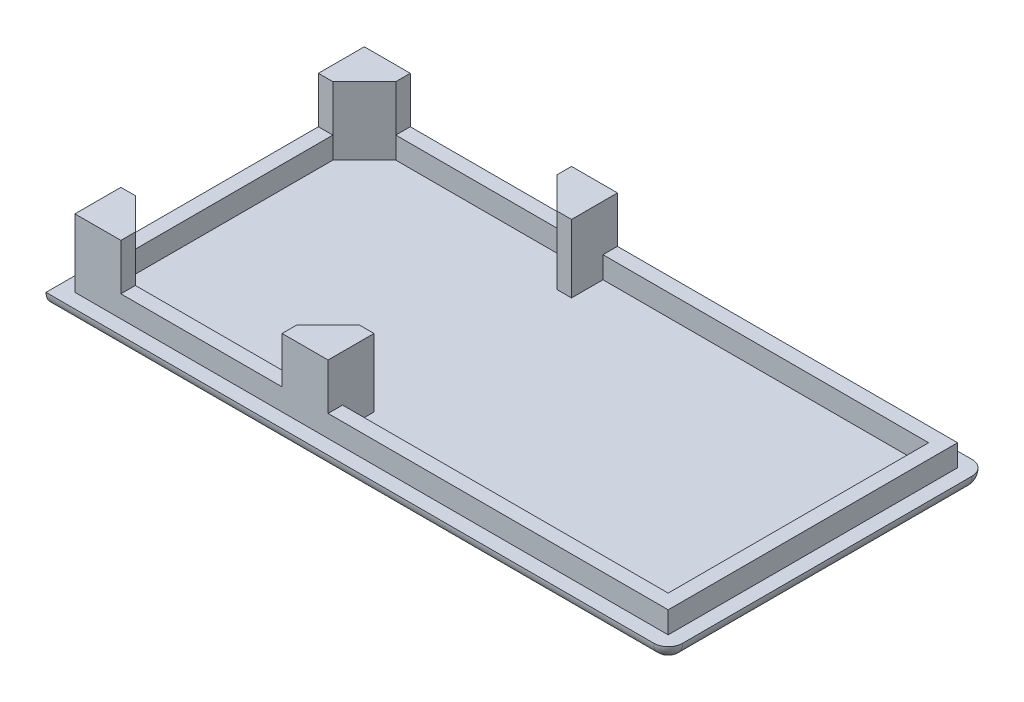
ISO-10303-21;
HEADER;
FILE_DESCRIPTION(('STEP AP214'),'2;1');
FILE_NAME('part.step','',(''),(''),'','','');
FILE_SCHEMA(('AUTOMOTIVE_DESIGN { 1 0 10303 214 1 1 1 1 }'));
ENDSEC;
DATA;
#1=APPLICATION_CONTEXT('core data for automotive mechanical design processes');
#2=APPLICATION_PROTOCOL_DEFINITION('international standard','automotive_design',2000,#1);
#3=PRODUCT_CONTEXT('',#1,'mechanical');
#4=PRODUCT('Part','Part','',(#3));
#5=PRODUCT_RELATED_PRODUCT_CATEGORY('part','',(#4));
#6=PRODUCT_DEFINITION_FORMATION('','',#4);
#7=PRODUCT_DEFINITION_CONTEXT('part definition',#1,'design');
#8=PRODUCT_DEFINITION('design','',#6,#7);
#9=PRODUCT_DEFINITION_SHAPE('','',#8);
#10=(LENGTH_UNIT() NAMED_UNIT(*) SI_UNIT(.MILLI.,.METRE.));
#11=(NAMED_UNIT(*) PLANE_ANGLE_UNIT() SI_UNIT($,.RADIAN.));
#12=(NAMED_UNIT(*) SI_UNIT($,.STERADIAN.) SOLID_ANGLE_UNIT());
#13=UNCERTAINTY_MEASURE_WITH_UNIT(LENGTH_MEASURE(1.E-05),#10,'distance_accuracy_value','');
#14=(GEOMETRIC_REPRESENTATION_CONTEXT(3) GLOBAL_UNCERTAINTY_ASSIGNED_CONTEXT((#13)) GLOBAL_UNIT_ASSIGNED_CONTEXT((#10,
#11,#12)) REPRESENTATION_CONTEXT('',''));
#15=CARTESIAN_POINT('',(0.,0.,0.));
#16=DIRECTION('',(0.,0.,1.));
#17=DIRECTION('',(1.,0.,0.));
#18=AXIS2_PLACEMENT_3D('',#15,#16,#17);
#19=CARTESIAN_POINT('',(0.,2.5,0.));
#20=DIRECTION('',(0.,1.,0.));
#21=DIRECTION('',(0.,0.,1.));
#22=AXIS2_PLACEMENT_3D('',#19,#20,#21);
#23=PLANE('',#22);
#24=DIRECTION('',(0.,0.,-1.));
#25=VECTOR('',#24,1.);
#26=CARTESIAN_POINT('',(18.494,2.5,0.));
#27=LINE('',#26,#25);
#28=CARTESIAN_POINT('',(18.494,2.5,2.));
#29=VERTEX_POINT('',#28);
#30=CARTESIAN_POINT('',(18.494,2.5,0.999999999999997));
#31=VERTEX_POINT('',#30);
#32=EDGE_CURVE('E304',#29,#31,#27,.T.);
#33=ORIENTED_EDGE('',*,*,#32,.F.);
#34=DIRECTION('',(-1.,0.,0.));
#35=VECTOR('',#34,1.);
#36=CARTESIAN_POINT('',(1.99999999999999,2.5,2.));
#37=LINE('',#36,#35);
#38=CARTESIAN_POINT('',(41.,2.5,2.));
#39=VERTEX_POINT('',#38);
#40=EDGE_CURVE('E416',#39,#29,#37,.T.);
#41=ORIENTED_EDGE('',*,*,#40,.F.);
#42=DIRECTION('',(0.,0.,-1.));
#43=VECTOR('',#42,1.);
#44=CARTESIAN_POINT('',(41.,2.5,2.));
#45=LINE('',#44,#43);
#46=CARTESIAN_POINT('',(41.,2.5,20.));
#47=VERTEX_POINT('',#46);
#48=EDGE_CURVE('E426',#47,#39,#45,.T.);
#49=ORIENTED_EDGE('',*,*,#48,.F.);
#50=DIRECTION('',(1.,0.,0.));
#51=VECTOR('',#50,1.);
#52=CARTESIAN_POINT('',(2.,2.5,20.));
#53=LINE('',#52,#51);
#54=CARTESIAN_POINT('',(18.494,2.5,20.));
#55=VERTEX_POINT('',#54);
#56=EDGE_CURVE('E422',#55,#47,#53,.T.);
#57=ORIENTED_EDGE('',*,*,#56,.F.);
#58=DIRECTION('',(0.,0.,-1.));
#59=VECTOR('',#58,1.);
#60=CARTESIAN_POINT('',(18.494,2.5,0.));
#61=LINE('',#60,#59);
#62=CARTESIAN_POINT('',(18.494,2.5,21.));
#63=VERTEX_POINT('',#62);
#64=EDGE_CURVE('E341',#63,#55,#61,.T.);
#65=ORIENTED_EDGE('',*,*,#64,.F.);
#66=DIRECTION('',(1.,0.,0.));
#67=VECTOR('',#66,1.);
#68=CARTESIAN_POINT('',(0.999999999999996,2.5,21.));
#69=LINE('',#68,#67);
#70=CARTESIAN_POINT('',(42.,2.5,21.));
#71=VERTEX_POINT('',#70);
#72=EDGE_CURVE('E448',#63,#71,#69,.T.);
#73=ORIENTED_EDGE('',*,*,#72,.T.);
#74=DIRECTION('',(0.,0.,-1.));
#75=VECTOR('',#74,1.);
#76=CARTESIAN_POINT('',(42.,2.5,0.999999999999997));
#77=LINE('',#76,#75);
#78=CARTESIAN_POINT('',(42.,2.5,0.999999999999997));
#79=VERTEX_POINT('',#78);
#80=EDGE_CURVE('E453',#71,#79,#77,.T.);
#81=ORIENTED_EDGE('',*,*,#80,.T.);
#82=DIRECTION('',(-1.,0.,0.));
#83=VECTOR('',#82,1.);
#84=CARTESIAN_POINT('',(0.999999999999994,2.5,0.999999999999997));
#85=LINE('',#84,#83);
#86=EDGE_CURVE('E455',#79,#31,#85,.T.);
#87=ORIENTED_EDGE('',*,*,#86,.T.);
#88=EDGE_LOOP('',(#33,#41,#49,#57,#65,#73,#81,#87));
#89=FACE_BOUND('',#88,.T.);
#90=ADVANCED_FACE('F35',(#89),#23,.T.);
#91=CARTESIAN_POINT('',(1.99999999999999,2.5,2.));
#92=DIRECTION('',(0.,0.,1.));
#93=DIRECTION('',(1.,0.,0.));
#94=AXIS2_PLACEMENT_3D('',#91,#92,#93);
#95=PLANE('',#94);
#96=DIRECTION('',(0.,1.,0.));
#97=VECTOR('',#96,1.);
#98=CARTESIAN_POINT('',(18.494,2.5,2.));
#99=LINE('',#98,#97);
#100=CARTESIAN_POINT('',(18.494,1.,2.));
#101=VERTEX_POINT('',#100);
#102=EDGE_CURVE('E297',#101,#29,#99,.T.);
#103=ORIENTED_EDGE('',*,*,#102,.F.);
#104=DIRECTION('',(-1.,0.,0.));
#105=VECTOR('',#104,1.);
#106=CARTESIAN_POINT('',(1.99999999999999,1.,2.));
#107=LINE('',#106,#105);
#108=CARTESIAN_POINT('',(41.,1.,2.));
#109=VERTEX_POINT('',#108);
#110=EDGE_CURVE('E429',#109,#101,#107,.T.);
#111=ORIENTED_EDGE('',*,*,#110,.F.);
#112=DIRECTION('',(0.,-1.,0.));
#113=VECTOR('',#112,1.);
#114=CARTESIAN_POINT('',(41.,2.5,2.));
#115=LINE('',#114,#113);
#116=EDGE_CURVE('E428',#39,#109,#115,.T.);
#117=ORIENTED_EDGE('',*,*,#116,.F.);
#118=ORIENTED_EDGE('',*,*,#40,.T.);
#119=EDGE_LOOP('',(#103,#111,#117,#118));
#120=FACE_BOUND('',#119,.T.);
#121=ADVANCED_FACE('F553',(#120),#95,.T.);
#122=DIRECTION('',(0.,0.,1.));
#123=VECTOR('',#122,1.);
#124=CARTESIAN_POINT('',(15.319,2.5,0.));
#125=LINE('',#124,#123);
#126=CARTESIAN_POINT('',(15.319,2.5,20.));
#127=VERTEX_POINT('',#126);
#128=CARTESIAN_POINT('',(15.319,2.5,21.));
#129=VERTEX_POINT('',#128);
#130=EDGE_CURVE('E343',#127,#129,#125,.T.);
#131=ORIENTED_EDGE('',*,*,#130,.F.);
#132=CARTESIAN_POINT('',(4.175,2.5,20.));
#133=VERTEX_POINT('',#132);
#134=EDGE_CURVE('E423',#133,#127,#53,.T.);
#135=ORIENTED_EDGE('',*,*,#134,.F.);
#136=DIRECTION('',(0.,0.,-1.));
#137=VECTOR('',#136,1.);
#138=CARTESIAN_POINT('',(4.175,2.5,0.));
#139=LINE('',#138,#137);
#140=CARTESIAN_POINT('',(4.175,2.5,21.));
#141=VERTEX_POINT('',#140);
#142=EDGE_CURVE('E401',#141,#133,#139,.T.);
#143=ORIENTED_EDGE('',*,*,#142,.F.);
#144=EDGE_CURVE('E450',#141,#129,#69,.T.);
#145=ORIENTED_EDGE('',*,*,#144,.T.);
#146=EDGE_LOOP('',(#131,#135,#143,#145));
#147=FACE_BOUND('',#146,.T.);
#148=ADVANCED_FACE('F556',(#147),#23,.T.);
#149=CARTESIAN_POINT('',(2.,2.5,20.));
#150=DIRECTION('',(0.,0.,-1.));
#151=DIRECTION('',(-1.,0.,0.));
#152=AXIS2_PLACEMENT_3D('',#149,#150,#151);
#153=PLANE('',#152);
#154=DIRECTION('',(0.,1.,0.));
#155=VECTOR('',#154,1.);
#156=CARTESIAN_POINT('',(15.319,1.,20.));
#157=LINE('',#156,#155);
#158=CARTESIAN_POINT('',(15.319,1.,20.));
#159=VERTEX_POINT('',#158);
#160=EDGE_CURVE('E331',#159,#127,#157,.T.);
#161=ORIENTED_EDGE('',*,*,#160,.F.);
#162=DIRECTION('',(1.,0.,0.));
#163=VECTOR('',#162,1.);
#164=CARTESIAN_POINT('',(2.,1.,20.));
#165=LINE('',#164,#163);
#166=CARTESIAN_POINT('',(4.175,1.,20.));
#167=VERTEX_POINT('',#166);
#168=EDGE_CURVE('E435',#167,#159,#165,.T.);
#169=ORIENTED_EDGE('',*,*,#168,.F.);
#170=DIRECTION('',(0.,1.,0.));
#171=VECTOR('',#170,1.);
#172=CARTESIAN_POINT('',(4.175,1.,20.));
#173=LINE('',#172,#171);
#174=EDGE_CURVE('E406',#167,#133,#173,.T.);
#175=ORIENTED_EDGE('',*,*,#174,.T.);
#176=ORIENTED_EDGE('',*,*,#134,.T.);
#177=EDGE_LOOP('',(#161,#169,#175,#176));
#178=FACE_BOUND('',#177,.T.);
#179=ADVANCED_FACE('F567',(#178),#153,.T.);
#180=DIRECTION('',(0.,0.,1.));
#181=VECTOR('',#180,1.);
#182=CARTESIAN_POINT('',(15.319,2.5,0.));
#183=LINE('',#182,#181);
#184=CARTESIAN_POINT('',(15.319,2.5,0.999999999999997));
#185=VERTEX_POINT('',#184);
#186=CARTESIAN_POINT('',(15.319,2.5,2.));
#187=VERTEX_POINT('',#186);
#188=EDGE_CURVE('E306',#185,#187,#183,.T.);
#189=ORIENTED_EDGE('',*,*,#188,.F.);
#190=CARTESIAN_POINT('',(4.17499999999999,2.5,0.999999999999997));
#191=VERTEX_POINT('',#190);
#192=EDGE_CURVE('E264',#185,#191,#85,.T.);
#193=ORIENTED_EDGE('',*,*,#192,.T.);
#194=DIRECTION('',(0.,0.,-1.));
#195=VECTOR('',#194,1.);
#196=CARTESIAN_POINT('',(4.175,2.5,0.));
#197=LINE('',#196,#195);
#198=CARTESIAN_POINT('',(4.17499999999999,2.5,2.));
#199=VERTEX_POINT('',#198);
#200=EDGE_CURVE('E377',#199,#191,#197,.T.);
#201=ORIENTED_EDGE('',*,*,#200,.F.);
#202=EDGE_CURVE('E420',#187,#199,#37,.T.);
#203=ORIENTED_EDGE('',*,*,#202,.F.);
#204=EDGE_LOOP('',(#189,#193,#201,#203));
#205=FACE_BOUND('',#204,.T.);
#206=ADVANCED_FACE('F569',(#205),#23,.T.);
#207=CARTESIAN_POINT('',(0.,1.,22.));
#208=DIRECTION('',(0.,-1.,0.));
#209=DIRECTION('',(0.,0.,-1.));
#210=AXIS2_PLACEMENT_3D('',#207,#208,#209);
#211=PLANE('',#210);
#212=DIRECTION('',(-1.,0.,0.));
#213=VECTOR('',#212,1.);
#214=CARTESIAN_POINT('',(0.,1.,22.));
#215=LINE('',#214,#213);
#216=CARTESIAN_POINT('',(42.,1.,22.));
#217=VERTEX_POINT('',#216);
#218=CARTESIAN_POINT('',(0.,1.,22.));
#219=VERTEX_POINT('',#218);
#220=EDGE_CURVE('E478',#217,#219,#215,.T.);
#221=ORIENTED_EDGE('',*,*,#220,.F.);
#222=CARTESIAN_POINT('',(42.,1.,21.));
#223=DIRECTION('',(0.,-1.,0.));
#224=DIRECTION('',(0.,0.,-1.));
#225=AXIS2_PLACEMENT_3D('',#222,#223,#224);
#226=CIRCLE('',#225,1.);
#227=CARTESIAN_POINT('',(43.,1.,21.));
#228=VERTEX_POINT('',#227);
#229=EDGE_CURVE('E494',#217,#228,#226,.F.);
#230=ORIENTED_EDGE('',*,*,#229,.T.);
#231=DIRECTION('',(0.,0.,-1.));
#232=VECTOR('',#231,1.);
#233=CARTESIAN_POINT('',(43.,1.,22.));
#234=LINE('',#233,#232);
#235=CARTESIAN_POINT('',(43.,1.,1.));
#236=VERTEX_POINT('',#235);
#237=EDGE_CURVE('E487',#228,#236,#234,.T.);
#238=ORIENTED_EDGE('',*,*,#237,.T.);
#239=CARTESIAN_POINT('',(42.,1.,1.));
#240=DIRECTION('',(0.,-1.,0.));
#241=DIRECTION('',(0.,0.,-1.));
#242=AXIS2_PLACEMENT_3D('',#239,#240,#241);
#243=CIRCLE('',#242,1.);
#244=CARTESIAN_POINT('',(42.,1.,0.));
#245=VERTEX_POINT('',#244);
#246=EDGE_CURVE('E492',#236,#245,#243,.F.);
#247=ORIENTED_EDGE('',*,*,#246,.T.);
#248=DIRECTION('',(-1.,0.,0.));
#249=VECTOR('',#248,1.);
#250=CARTESIAN_POINT('',(0.,1.,0.));
#251=LINE('',#250,#249);
#252=CARTESIAN_POINT('',(0.,1.,0.));
#253=VERTEX_POINT('',#252);
#254=EDGE_CURVE('E482',#245,#253,#251,.T.);
#255=ORIENTED_EDGE('',*,*,#254,.T.);
#256=DIRECTION('',(0.,0.,-1.));
#257=VECTOR('',#256,1.);
#258=CARTESIAN_POINT('',(0.,1.,22.));
#259=LINE('',#258,#257);
#260=EDGE_CURVE('E481',#219,#253,#259,.T.);
#261=ORIENTED_EDGE('',*,*,#260,.F.);
#262=EDGE_LOOP('',(#221,#230,#238,#247,#255,#261));
#263=FACE_BOUND('',#262,.T.);
#264=DIRECTION('',(0.,0.,1.));
#265=VECTOR('',#264,1.);
#266=CARTESIAN_POINT('',(0.999999999999994,1.,0.999999999999997));
#267=LINE('',#266,#265);
#268=CARTESIAN_POINT('',(0.999999999999994,1.,0.999999999999997));
#269=VERTEX_POINT('',#268);
#270=CARTESIAN_POINT('',(0.999999999999996,1.,21.));
#271=VERTEX_POINT('',#270);
#272=EDGE_CURVE('E445',#269,#271,#267,.T.);
#273=ORIENTED_EDGE('',*,*,#272,.F.);
#274=DIRECTION('',(-1.,0.,0.));
#275=VECTOR('',#274,1.);
#276=CARTESIAN_POINT('',(0.999999999999994,1.,0.999999999999997));
#277=LINE('',#276,#275);
#278=CARTESIAN_POINT('',(42.,1.,0.999999999999997));
#279=VERTEX_POINT('',#278);
#280=EDGE_CURVE('E449',#279,#269,#277,.T.);
#281=ORIENTED_EDGE('',*,*,#280,.F.);
#282=DIRECTION('',(0.,0.,-1.));
#283=VECTOR('',#282,1.);
#284=CARTESIAN_POINT('',(42.,1.,0.999999999999997));
#285=LINE('',#284,#283);
#286=CARTESIAN_POINT('',(42.,1.,21.));
#287=VERTEX_POINT('',#286);
#288=EDGE_CURVE('E462',#287,#279,#285,.T.);
#289=ORIENTED_EDGE('',*,*,#288,.F.);
#290=DIRECTION('',(1.,0.,0.));
#291=VECTOR('',#290,1.);
#292=CARTESIAN_POINT('',(0.999999999999996,1.,21.));
#293=LINE('',#292,#291);
#294=EDGE_CURVE('E460',#271,#287,#293,.T.);
#295=ORIENTED_EDGE('',*,*,#294,.F.);
#296=EDGE_LOOP('',(#273,#281,#289,#295));
#297=FACE_BOUND('',#296,.T.);
#298=ADVANCED_FACE('F525',(#263,#297),#211,.F.);
#299=CARTESIAN_POINT('',(0.,0.,22.));
#300=DIRECTION('',(1.,0.,0.));
#301=DIRECTION('',(0.,0.,-1.));
#302=AXIS2_PLACEMENT_3D('',#299,#300,#301);
#303=PLANE('',#302);
#304=ORIENTED_EDGE('',*,*,#260,.T.);
#305=CARTESIAN_POINT('',(0.,1.,1.));
#306=DIRECTION('',(1.,0.,0.));
#307=DIRECTION('',(0.,0.,-1.));
#308=AXIS2_PLACEMENT_3D('',#305,#306,#307);
#309=CIRCLE('',#308,1.);
#310=CARTESIAN_POINT('',(0.,0.,1.));
#311=VERTEX_POINT('',#310);
#312=EDGE_CURVE('E43',#253,#311,#309,.F.);
#313=ORIENTED_EDGE('',*,*,#312,.T.);
#314=DIRECTION('',(0.,0.,-1.));
#315=VECTOR('',#314,1.);
#316=CARTESIAN_POINT('',(0.,0.,22.));
#317=LINE('',#316,#315);
#318=CARTESIAN_POINT('',(0.,0.,21.));
#319=VERTEX_POINT('',#318);
#320=EDGE_CURVE('E489',#319,#311,#317,.T.);
#321=ORIENTED_EDGE('',*,*,#320,.F.);
#322=CARTESIAN_POINT('',(0.,1.,21.));
#323=DIRECTION('',(1.,0.,0.));
#324=DIRECTION('',(0.,0.,-1.));
#325=AXIS2_PLACEMENT_3D('',#322,#323,#324);
#326=CIRCLE('',#325,1.);
#327=EDGE_CURVE('E503',#319,#219,#326,.F.);
#328=ORIENTED_EDGE('',*,*,#327,.T.);
#329=EDGE_LOOP('',(#304,#313,#321,#328));
#330=FACE_BOUND('',#329,.T.);
#331=ADVANCED_FACE('F528',(#330),#303,.F.);
#332=CARTESIAN_POINT('',(0.,0.,22.));
#333=DIRECTION('',(0.,1.,0.));
#334=DIRECTION('',(0.,0.,1.));
#335=AXIS2_PLACEMENT_3D('',#332,#333,#334);
#336=PLANE('',#335);
#337=ORIENTED_EDGE('',*,*,#320,.T.);
#338=DIRECTION('',(1.,0.,0.));
#339=VECTOR('',#338,1.);
#340=CARTESIAN_POINT('',(43.,0.,1.));
#341=LINE('',#340,#339);
#342=CARTESIAN_POINT('',(42.,0.,1.));
#343=VERTEX_POINT('',#342);
#344=EDGE_CURVE('E501',#311,#343,#341,.T.);
#345=ORIENTED_EDGE('',*,*,#344,.T.);
#346=DIRECTION('',(0.,0.,-1.));
#347=VECTOR('',#346,1.);
#348=CARTESIAN_POINT('',(42.,0.,22.));
#349=LINE('',#348,#347);
#350=CARTESIAN_POINT('',(42.,0.,21.));
#351=VERTEX_POINT('',#350);
#352=EDGE_CURVE('E499',#343,#351,#349,.F.);
#353=ORIENTED_EDGE('',*,*,#352,.T.);
#354=DIRECTION('',(1.,0.,0.));
#355=VECTOR('',#354,1.);
#356=CARTESIAN_POINT('',(0.,0.,21.));
#357=LINE('',#356,#355);
#358=EDGE_CURVE('E497',#351,#319,#357,.F.);
#359=ORIENTED_EDGE('',*,*,#358,.T.);
#360=EDGE_LOOP('',(#337,#345,#353,#359));
#361=FACE_BOUND('',#360,.T.);
#362=ADVANCED_FACE('F543',(#361),#336,.F.);
#363=CARTESIAN_POINT('',(0.,1.,1.));
#364=DIRECTION('',(-1.,0.,0.));
#365=DIRECTION('',(0.,0.,1.));
#366=AXIS2_PLACEMENT_3D('',#363,#364,#365);
#367=CYLINDRICAL_SURFACE('',#366,1.);
#368=ORIENTED_EDGE('',*,*,#312,.F.);
#369=ORIENTED_EDGE('',*,*,#254,.F.);
#370=CARTESIAN_POINT('',(42.,1.,1.));
#371=DIRECTION('',(1.,0.,0.));
#372=DIRECTION('',(0.,0.,-1.));
#373=AXIS2_PLACEMENT_3D('',#370,#371,#372);
#374=CIRCLE('',#373,1.);
#375=EDGE_CURVE('E484',#343,#245,#374,.T.);
#376=ORIENTED_EDGE('',*,*,#375,.F.);
#377=ORIENTED_EDGE('',*,*,#344,.F.);
#378=EDGE_LOOP('',(#368,#369,#376,#377));
#379=FACE_BOUND('',#378,.T.);
#380=ADVANCED_FACE('F37',(#379),#367,.T.);
#381=CARTESIAN_POINT('',(42.,1.,1.));
#382=DIRECTION('',(0.,0.,1.));
#383=DIRECTION('',(1.,0.,0.));
#384=AXIS2_PLACEMENT_3D('',#381,#382,#383);
#385=SPHERICAL_SURFACE('',#384,1.);
#386=ORIENTED_EDGE('',*,*,#375,.T.);
#387=ORIENTED_EDGE('',*,*,#246,.F.);
#388=CARTESIAN_POINT('',(42.,1.,1.));
#389=DIRECTION('',(0.,0.,-1.));
#390=DIRECTION('',(-1.,0.,0.));
#391=AXIS2_PLACEMENT_3D('',#388,#389,#390);
#392=CIRCLE('',#391,1.);
#393=EDGE_CURVE('E510',#343,#236,#392,.F.);
#394=ORIENTED_EDGE('',*,*,#393,.F.);
#395=EDGE_LOOP('',(#386,#387,#394));
#396=FACE_BOUND('',#395,.T.);
#397=ADVANCED_FACE('F517',(#396),#385,.T.);
#398=CARTESIAN_POINT('',(42.,1.,22.));
#399=DIRECTION('',(0.,0.,-1.));
#400=DIRECTION('',(-1.,0.,0.));
#401=AXIS2_PLACEMENT_3D('',#398,#399,#400);
#402=CYLINDRICAL_SURFACE('',#401,1.);
#403=ORIENTED_EDGE('',*,*,#393,.T.);
#404=ORIENTED_EDGE('',*,*,#237,.F.);
#405=CARTESIAN_POINT('',(42.,1.,21.));
#406=DIRECTION('',(0.,0.,1.));
#407=DIRECTION('',(1.,0.,0.));
#408=AXIS2_PLACEMENT_3D('',#405,#406,#407);
#409=CIRCLE('',#408,1.);
#410=EDGE_CURVE('E508',#351,#228,#409,.T.);
#411=ORIENTED_EDGE('',*,*,#410,.F.);
#412=ORIENTED_EDGE('',*,*,#352,.F.);
#413=EDGE_LOOP('',(#403,#404,#411,#412));
#414=FACE_BOUND('',#413,.T.);
#415=ADVANCED_FACE('F541',(#414),#402,.T.);
#416=CARTESIAN_POINT('',(0.,1.,21.));
#417=DIRECTION('',(1.,0.,0.));
#418=DIRECTION('',(0.,0.,-1.));
#419=AXIS2_PLACEMENT_3D('',#416,#417,#418);
#420=CYLINDRICAL_SURFACE('',#419,1.);
#421=ORIENTED_EDGE('',*,*,#327,.F.);
#422=ORIENTED_EDGE('',*,*,#358,.F.);
#423=CARTESIAN_POINT('',(42.,1.,21.));
#424=DIRECTION('',(1.,0.,0.));
#425=DIRECTION('',(0.,0.,-1.));
#426=AXIS2_PLACEMENT_3D('',#423,#424,#425);
#427=CIRCLE('',#426,1.);
#428=EDGE_CURVE('E477',#217,#351,#427,.T.);
#429=ORIENTED_EDGE('',*,*,#428,.F.);
#430=ORIENTED_EDGE('',*,*,#220,.T.);
#431=EDGE_LOOP('',(#421,#422,#429,#430));
#432=FACE_BOUND('',#431,.T.);
#433=ADVANCED_FACE('F533',(#432),#420,.T.);
#434=CARTESIAN_POINT('',(42.,1.,21.));
#435=DIRECTION('',(0.,0.,1.));
#436=DIRECTION('',(1.,0.,0.));
#437=AXIS2_PLACEMENT_3D('',#434,#435,#436);
#438=SPHERICAL_SURFACE('',#437,1.);
#439=ORIENTED_EDGE('',*,*,#229,.F.);
#440=ORIENTED_EDGE('',*,*,#428,.T.);
#441=ORIENTED_EDGE('',*,*,#410,.T.);
#442=EDGE_LOOP('',(#439,#440,#441));
#443=FACE_BOUND('',#442,.T.);
#444=ADVANCED_FACE('F539',(#443),#438,.T.);
#445=DIRECTION('',(1.,0.,0.));
#446=VECTOR('',#445,1.);
#447=CARTESIAN_POINT('',(0.,2.5,4.175));
#448=LINE('',#447,#446);
#449=CARTESIAN_POINT('',(0.999999999999994,2.5,4.175));
#450=VERTEX_POINT('',#449);
#451=CARTESIAN_POINT('',(1.99999999999999,2.5,4.175));
#452=VERTEX_POINT('',#451);
#453=EDGE_CURVE('E366',#450,#452,#448,.T.);
#454=ORIENTED_EDGE('',*,*,#453,.F.);
#455=DIRECTION('',(0.,0.,1.));
#456=VECTOR('',#455,1.);
#457=CARTESIAN_POINT('',(0.999999999999994,2.5,0.999999999999997));
#458=LINE('',#457,#456);
#459=CARTESIAN_POINT('',(0.999999999999994,2.5,17.825));
#460=VERTEX_POINT('',#459);
#461=EDGE_CURVE('E446',#450,#460,#458,.T.);
#462=ORIENTED_EDGE('',*,*,#461,.T.);
#463=DIRECTION('',(-1.,0.,0.));
#464=VECTOR('',#463,1.);
#465=CARTESIAN_POINT('',(0.,2.5,17.825));
#466=LINE('',#465,#464);
#467=CARTESIAN_POINT('',(1.99999999999999,2.5,17.825));
#468=VERTEX_POINT('',#467);
#469=EDGE_CURVE('E412',#468,#460,#466,.T.);
#470=ORIENTED_EDGE('',*,*,#469,.F.);
#471=DIRECTION('',(0.,0.,1.));
#472=VECTOR('',#471,1.);
#473=CARTESIAN_POINT('',(1.99999999999999,2.5,2.));
#474=LINE('',#473,#472);
#475=EDGE_CURVE('E419',#452,#468,#474,.T.);
#476=ORIENTED_EDGE('',*,*,#475,.F.);
#477=EDGE_LOOP('',(#454,#462,#470,#476));
#478=FACE_BOUND('',#477,.T.);
#479=ADVANCED_FACE('F557',(#478),#23,.T.);
#480=CARTESIAN_POINT('',(0.999999999999994,2.5,0.999999999999997));
#481=DIRECTION('',(1.,0.,0.));
#482=DIRECTION('',(0.,0.,-1.));
#483=AXIS2_PLACEMENT_3D('',#480,#481,#482);
#484=PLANE('',#483);
#485=ORIENTED_EDGE('',*,*,#461,.F.);
#486=DIRECTION('',(0.,1.,0.));
#487=VECTOR('',#486,1.);
#488=CARTESIAN_POINT('',(0.999999999999994,1.,4.175));
#489=LINE('',#488,#487);
#490=CARTESIAN_POINT('',(0.999999999999994,5.699,4.175));
#491=VERTEX_POINT('',#490);
#492=EDGE_CURVE('E363',#450,#491,#489,.T.);
#493=ORIENTED_EDGE('',*,*,#492,.T.);
#494=DIRECTION('',(0.,0.,1.));
#495=VECTOR('',#494,1.);
#496=CARTESIAN_POINT('',(0.999999999999994,5.699,0.999999999999997));
#497=LINE('',#496,#495);
#498=CARTESIAN_POINT('',(0.999999999999994,5.699,0.999999999999997));
#499=VERTEX_POINT('',#498);
#500=EDGE_CURVE('E348',#499,#491,#497,.T.);
#501=ORIENTED_EDGE('',*,*,#500,.F.);
#502=DIRECTION('',(0.,-1.,0.));
#503=VECTOR('',#502,1.);
#504=CARTESIAN_POINT('',(0.999999999999994,2.5,0.999999999999997));
#505=LINE('',#504,#503);
#506=EDGE_CURVE('E458',#499,#269,#505,.T.);
#507=ORIENTED_EDGE('',*,*,#506,.T.);
#508=ORIENTED_EDGE('',*,*,#272,.T.);
#509=DIRECTION('',(0.,-1.,0.));
#510=VECTOR('',#509,1.);
#511=CARTESIAN_POINT('',(0.999999999999996,2.5,21.));
#512=LINE('',#511,#510);
#513=CARTESIAN_POINT('',(0.999999999999996,5.699,21.));
#514=VERTEX_POINT('',#513);
#515=EDGE_CURVE('E474',#514,#271,#512,.T.);
#516=ORIENTED_EDGE('',*,*,#515,.F.);
#517=DIRECTION('',(0.,0.,1.));
#518=VECTOR('',#517,1.);
#519=CARTESIAN_POINT('',(0.999999999999994,5.699,17.825));
#520=LINE('',#519,#518);
#521=CARTESIAN_POINT('',(0.999999999999994,5.699,17.825));
#522=VERTEX_POINT('',#521);
#523=EDGE_CURVE('E380',#522,#514,#520,.T.);
#524=ORIENTED_EDGE('',*,*,#523,.F.);
#525=DIRECTION('',(0.,1.,0.));
#526=VECTOR('',#525,1.);
#527=CARTESIAN_POINT('',(0.999999999999994,1.,17.825));
#528=LINE('',#527,#526);
#529=EDGE_CURVE('E399',#460,#522,#528,.T.);
#530=ORIENTED_EDGE('',*,*,#529,.F.);
#531=EDGE_LOOP('',(#485,#493,#501,#507,#508,#516,#524,#530));
#532=FACE_BOUND('',#531,.T.);
#533=ADVANCED_FACE('F571',(#532),#484,.F.);
#534=CARTESIAN_POINT('',(0.999999999999996,2.5,21.));
#535=DIRECTION('',(0.,0.,-1.));
#536=DIRECTION('',(-1.,0.,0.));
#537=AXIS2_PLACEMENT_3D('',#534,#535,#536);
#538=PLANE('',#537);
#539=ORIENTED_EDGE('',*,*,#72,.F.);
#540=DIRECTION('',(0.,1.,0.));
#541=VECTOR('',#540,1.);
#542=CARTESIAN_POINT('',(18.494,1.,21.));
#543=LINE('',#542,#541);
#544=CARTESIAN_POINT('',(18.494,5.699,21.));
#545=VERTEX_POINT('',#544);
#546=EDGE_CURVE('E328',#63,#545,#543,.T.);
#547=ORIENTED_EDGE('',*,*,#546,.T.);
#548=DIRECTION('',(1.,0.,0.));
#549=VECTOR('',#548,1.);
#550=CARTESIAN_POINT('',(15.319,5.699,21.));
#551=LINE('',#550,#549);
#552=CARTESIAN_POINT('',(15.319,5.699,21.));
#553=VERTEX_POINT('',#552);
#554=EDGE_CURVE('E308',#553,#545,#551,.T.);
#555=ORIENTED_EDGE('',*,*,#554,.F.);
#556=DIRECTION('',(0.,1.,0.));
#557=VECTOR('',#556,1.);
#558=CARTESIAN_POINT('',(15.319,1.,21.));
#559=LINE('',#558,#557);
#560=EDGE_CURVE('E329',#129,#553,#559,.T.);
#561=ORIENTED_EDGE('',*,*,#560,.F.);
#562=ORIENTED_EDGE('',*,*,#144,.F.);
#563=DIRECTION('',(0.,1.,0.));
#564=VECTOR('',#563,1.);
#565=CARTESIAN_POINT('',(4.175,1.,21.));
#566=LINE('',#565,#564);
#567=CARTESIAN_POINT('',(4.175,5.699,21.));
#568=VERTEX_POINT('',#567);
#569=EDGE_CURVE('E398',#141,#568,#566,.T.);
#570=ORIENTED_EDGE('',*,*,#569,.T.);
#571=DIRECTION('',(1.,0.,0.));
#572=VECTOR('',#571,1.);
#573=CARTESIAN_POINT('',(0.999999999999996,5.699,21.));
#574=LINE('',#573,#572);
#575=EDGE_CURVE('E383',#514,#568,#574,.T.);
#576=ORIENTED_EDGE('',*,*,#575,.F.);
#577=ORIENTED_EDGE('',*,*,#515,.T.);
#578=ORIENTED_EDGE('',*,*,#294,.T.);
#579=DIRECTION('',(0.,-1.,0.));
#580=VECTOR('',#579,1.);
#581=CARTESIAN_POINT('',(42.,2.5,21.));
#582=LINE('',#581,#580);
#583=EDGE_CURVE('E471',#71,#287,#582,.T.);
#584=ORIENTED_EDGE('',*,*,#583,.F.);
#585=EDGE_LOOP('',(#539,#547,#555,#561,#562,#570,#576,#577,#578,#584));
#586=FACE_BOUND('',#585,.T.);
#587=ADVANCED_FACE('F577',(#586),#538,.F.);
#588=CARTESIAN_POINT('',(42.,2.5,0.999999999999997));
#589=DIRECTION('',(-1.,0.,0.));
#590=DIRECTION('',(0.,0.,1.));
#591=AXIS2_PLACEMENT_3D('',#588,#589,#590);
#592=PLANE('',#591);
#593=ORIENTED_EDGE('',*,*,#288,.T.);
#594=DIRECTION('',(0.,-1.,0.));
#595=VECTOR('',#594,1.);
#596=CARTESIAN_POINT('',(42.,2.5,0.999999999999997));
#597=LINE('',#596,#595);
#598=EDGE_CURVE('E468',#79,#279,#597,.T.);
#599=ORIENTED_EDGE('',*,*,#598,.F.);
#600=ORIENTED_EDGE('',*,*,#80,.F.);
#601=ORIENTED_EDGE('',*,*,#583,.T.);
#602=EDGE_LOOP('',(#593,#599,#600,#601));
#603=FACE_BOUND('',#602,.T.);
#604=ADVANCED_FACE('F729',(#603),#592,.F.);
#605=CARTESIAN_POINT('',(0.999999999999994,2.5,0.999999999999997));
#606=DIRECTION('',(0.,0.,1.));
#607=DIRECTION('',(1.,0.,0.));
#608=AXIS2_PLACEMENT_3D('',#605,#606,#607);
#609=PLANE('',#608);
#610=ORIENTED_EDGE('',*,*,#192,.F.);
#611=DIRECTION('',(0.,1.,0.));
#612=VECTOR('',#611,1.);
#613=CARTESIAN_POINT('',(15.319,1.,0.999999999999997));
#614=LINE('',#613,#612);
#615=CARTESIAN_POINT('',(15.319,5.699,0.999999999999997));
#616=VERTEX_POINT('',#615);
#617=EDGE_CURVE('E257',#185,#616,#614,.T.);
#618=ORIENTED_EDGE('',*,*,#617,.T.);
#619=DIRECTION('',(-1.,0.,0.));
#620=VECTOR('',#619,1.);
#621=CARTESIAN_POINT('',(15.319,5.699,0.999999999999997));
#622=LINE('',#621,#620);
#623=CARTESIAN_POINT('',(18.494,5.699,0.999999999999997));
#624=VERTEX_POINT('',#623);
#625=EDGE_CURVE('E262',#624,#616,#622,.T.);
#626=ORIENTED_EDGE('',*,*,#625,.F.);
#627=DIRECTION('',(0.,1.,0.));
#628=VECTOR('',#627,1.);
#629=CARTESIAN_POINT('',(18.494,1.,0.999999999999997));
#630=LINE('',#629,#628);
#631=EDGE_CURVE('E295',#31,#624,#630,.T.);
#632=ORIENTED_EDGE('',*,*,#631,.F.);
#633=ORIENTED_EDGE('',*,*,#86,.F.);
#634=ORIENTED_EDGE('',*,*,#598,.T.);
#635=ORIENTED_EDGE('',*,*,#280,.T.);
#636=ORIENTED_EDGE('',*,*,#506,.F.);
#637=DIRECTION('',(-1.,0.,0.));
#638=VECTOR('',#637,1.);
#639=CARTESIAN_POINT('',(4.17499999999999,5.699,0.999999999999997));
#640=LINE('',#639,#638);
#641=CARTESIAN_POINT('',(4.17499999999999,5.699,0.999999999999997));
#642=VERTEX_POINT('',#641);
#643=EDGE_CURVE('E345',#642,#499,#640,.T.);
#644=ORIENTED_EDGE('',*,*,#643,.F.);
#645=DIRECTION('',(0.,1.,0.));
#646=VECTOR('',#645,1.);
#647=CARTESIAN_POINT('',(4.17499999999999,1.,0.999999999999997));
#648=LINE('',#647,#646);
#649=EDGE_CURVE('E364',#191,#642,#648,.T.);
#650=ORIENTED_EDGE('',*,*,#649,.F.);
#651=EDGE_LOOP('',(#610,#618,#626,#632,#633,#634,#635,#636,#644,#650));
#652=FACE_BOUND('',#651,.T.);
#653=ADVANCED_FACE('F259',(#652),#609,.F.);
#654=DIRECTION('',(0.,1.,0.));
#655=VECTOR('',#654,1.);
#656=CARTESIAN_POINT('',(15.319,1.,2.));
#657=LINE('',#656,#655);
#658=CARTESIAN_POINT('',(15.319,1.,1.99999999999999));
#659=VERTEX_POINT('',#658);
#660=EDGE_CURVE('E50',#659,#187,#657,.T.);
#661=ORIENTED_EDGE('',*,*,#660,.T.);
#662=ORIENTED_EDGE('',*,*,#202,.T.);
#663=DIRECTION('',(0.,1.,0.));
#664=VECTOR('',#663,1.);
#665=CARTESIAN_POINT('',(4.17499999999999,1.,2.));
#666=LINE('',#665,#664);
#667=CARTESIAN_POINT('',(4.17499999999999,1.,2.));
#668=VERTEX_POINT('',#667);
#669=EDGE_CURVE('E367',#668,#199,#666,.T.);
#670=ORIENTED_EDGE('',*,*,#669,.F.);
#671=EDGE_CURVE('E415',#659,#668,#107,.T.);
#672=ORIENTED_EDGE('',*,*,#671,.F.);
#673=EDGE_LOOP('',(#661,#662,#670,#672));
#674=FACE_BOUND('',#673,.T.);
#675=ADVANCED_FACE('F563',(#674),#95,.T.);
#676=CARTESIAN_POINT('',(1.99999999999999,2.5,2.));
#677=DIRECTION('',(1.,0.,0.));
#678=DIRECTION('',(0.,0.,-1.));
#679=AXIS2_PLACEMENT_3D('',#676,#677,#678);
#680=PLANE('',#679);
#681=DIRECTION('',(0.,1.,0.));
#682=VECTOR('',#681,1.);
#683=CARTESIAN_POINT('',(1.99999999999999,1.,4.175));
#684=LINE('',#683,#682);
#685=CARTESIAN_POINT('',(2.,1.,4.175));
#686=VERTEX_POINT('',#685);
#687=EDGE_CURVE('E371',#686,#452,#684,.T.);
#688=ORIENTED_EDGE('',*,*,#687,.T.);
#689=ORIENTED_EDGE('',*,*,#475,.T.);
#690=DIRECTION('',(0.,1.,0.));
#691=VECTOR('',#690,1.);
#692=CARTESIAN_POINT('',(1.99999999999999,1.,17.825));
#693=LINE('',#692,#691);
#694=CARTESIAN_POINT('',(1.99999999999999,1.,17.825));
#695=VERTEX_POINT('',#694);
#696=EDGE_CURVE('E402',#695,#468,#693,.T.);
#697=ORIENTED_EDGE('',*,*,#696,.F.);
#698=DIRECTION('',(0.,0.,1.));
#699=VECTOR('',#698,1.);
#700=CARTESIAN_POINT('',(1.99999999999999,1.,2.));
#701=LINE('',#700,#699);
#702=EDGE_CURVE('E432',#686,#695,#701,.T.);
#703=ORIENTED_EDGE('',*,*,#702,.F.);
#704=EDGE_LOOP('',(#688,#689,#697,#703));
#705=FACE_BOUND('',#704,.T.);
#706=ADVANCED_FACE('F609',(#705),#680,.T.);
#707=DIRECTION('',(0.,-1.,0.));
#708=VECTOR('',#707,1.);
#709=CARTESIAN_POINT('',(18.494,2.5,20.));
#710=LINE('',#709,#708);
#711=CARTESIAN_POINT('',(18.494,1.,20.));
#712=VERTEX_POINT('',#711);
#713=EDGE_CURVE('E58',#55,#712,#710,.T.);
#714=ORIENTED_EDGE('',*,*,#713,.F.);
#715=ORIENTED_EDGE('',*,*,#56,.T.);
#716=DIRECTION('',(0.,-1.,0.));
#717=VECTOR('',#716,1.);
#718=CARTESIAN_POINT('',(41.,2.5,20.));
#719=LINE('',#718,#717);
#720=CARTESIAN_POINT('',(41.,1.,20.));
#721=VERTEX_POINT('',#720);
#722=EDGE_CURVE('E442',#47,#721,#719,.T.);
#723=ORIENTED_EDGE('',*,*,#722,.T.);
#724=EDGE_CURVE('E434',#712,#721,#165,.T.);
#725=ORIENTED_EDGE('',*,*,#724,.F.);
#726=EDGE_LOOP('',(#714,#715,#723,#725));
#727=FACE_BOUND('',#726,.T.);
#728=ADVANCED_FACE('F591',(#727),#153,.T.);
#729=CARTESIAN_POINT('',(41.,2.5,2.));
#730=DIRECTION('',(-1.,0.,0.));
#731=DIRECTION('',(0.,0.,1.));
#732=AXIS2_PLACEMENT_3D('',#729,#730,#731);
#733=PLANE('',#732);
#734=DIRECTION('',(0.,0.,-1.));
#735=VECTOR('',#734,1.);
#736=CARTESIAN_POINT('',(41.,1.,2.));
#737=LINE('',#736,#735);
#738=EDGE_CURVE('E438',#721,#109,#737,.T.);
#739=ORIENTED_EDGE('',*,*,#738,.F.);
#740=ORIENTED_EDGE('',*,*,#722,.F.);
#741=ORIENTED_EDGE('',*,*,#48,.T.);
#742=ORIENTED_EDGE('',*,*,#116,.T.);
#743=EDGE_LOOP('',(#739,#740,#741,#742));
#744=FACE_BOUND('',#743,.T.);
#745=ADVANCED_FACE('F660',(#744),#733,.T.);
#746=ORIENTED_EDGE('',*,*,#110,.T.);
#747=DIRECTION('',(0.,0.,-1.));
#748=VECTOR('',#747,1.);
#749=CARTESIAN_POINT('',(18.494,1.,0.999999999999997));
#750=LINE('',#749,#748);
#751=CARTESIAN_POINT('',(18.494,1.,4.175));
#752=VERTEX_POINT('',#751);
#753=EDGE_CURVE('E268',#752,#101,#750,.T.);
#754=ORIENTED_EDGE('',*,*,#753,.F.);
#755=DIRECTION('',(1.,0.,0.));
#756=VECTOR('',#755,1.);
#757=CARTESIAN_POINT('',(18.494,1.,4.175));
#758=LINE('',#757,#756);
#759=CARTESIAN_POINT('',(17.494,1.,4.175));
#760=VERTEX_POINT('',#759);
#761=EDGE_CURVE('E291',#760,#752,#758,.T.);
#762=ORIENTED_EDGE('',*,*,#761,.F.);
#763=DIRECTION('',(0.707106781186547,0.,0.707106781186547));
#764=VECTOR('',#763,1.);
#765=CARTESIAN_POINT('',(17.494,1.,4.175));
#766=LINE('',#765,#764);
#767=EDGE_CURVE('E289',#659,#760,#766,.T.);
#768=ORIENTED_EDGE('',*,*,#767,.F.);
#769=ORIENTED_EDGE('',*,*,#671,.T.);
#770=DIRECTION('',(0.707106781186547,0.,-0.707106781186548));
#771=VECTOR('',#770,1.);
#772=CARTESIAN_POINT('',(1.99999999999999,1.,4.175));
#773=LINE('',#772,#771);
#774=EDGE_CURVE('E360',#686,#668,#773,.T.);
#775=ORIENTED_EDGE('',*,*,#774,.F.);
#776=ORIENTED_EDGE('',*,*,#702,.T.);
#777=DIRECTION('',(-0.707106781186548,0.,-0.707106781186547));
#778=VECTOR('',#777,1.);
#779=CARTESIAN_POINT('',(4.175,1.,20.));
#780=LINE('',#779,#778);
#781=EDGE_CURVE('E395',#167,#695,#780,.T.);
#782=ORIENTED_EDGE('',*,*,#781,.F.);
#783=ORIENTED_EDGE('',*,*,#168,.T.);
#784=DIRECTION('',(-0.707106781186547,0.,0.707106781186547));
#785=VECTOR('',#784,1.);
#786=CARTESIAN_POINT('',(17.494,1.,17.825));
#787=LINE('',#786,#785);
#788=CARTESIAN_POINT('',(17.494,1.,17.825));
#789=VERTEX_POINT('',#788);
#790=EDGE_CURVE('E326',#789,#159,#787,.T.);
#791=ORIENTED_EDGE('',*,*,#790,.F.);
#792=DIRECTION('',(-1.,0.,0.));
#793=VECTOR('',#792,1.);
#794=CARTESIAN_POINT('',(18.494,1.,17.825));
#795=LINE('',#794,#793);
#796=CARTESIAN_POINT('',(18.494,1.,17.825));
#797=VERTEX_POINT('',#796);
#798=EDGE_CURVE('E323',#797,#789,#795,.T.);
#799=ORIENTED_EDGE('',*,*,#798,.F.);
#800=DIRECTION('',(0.,0.,1.));
#801=VECTOR('',#800,1.);
#802=CARTESIAN_POINT('',(18.494,1.,22.));
#803=LINE('',#802,#801);
#804=EDGE_CURVE('E11',#797,#712,#803,.T.);
#805=ORIENTED_EDGE('',*,*,#804,.T.);
#806=ORIENTED_EDGE('',*,*,#724,.T.);
#807=ORIENTED_EDGE('',*,*,#738,.T.);
#808=EDGE_LOOP('',(#746,#754,#762,#768,#769,#775,#776,#782,#783,#791,#799,#805,#806,#807));
#809=FACE_BOUND('',#808,.T.);
#810=ADVANCED_FACE('F588',(#809),#211,.F.);
#811=CARTESIAN_POINT('',(1.99999999999999,1.,17.825));
#812=DIRECTION('',(0.,0.,-1.));
#813=DIRECTION('',(-1.,0.,0.));
#814=AXIS2_PLACEMENT_3D('',#811,#812,#813);
#815=PLANE('',#814);
#816=CARTESIAN_POINT('',(1.99999999999999,5.699,17.825));
#817=VERTEX_POINT('',#816);
#818=EDGE_CURVE('E405',#468,#817,#693,.T.);
#819=ORIENTED_EDGE('',*,*,#818,.F.);
#820=ORIENTED_EDGE('',*,*,#469,.T.);
#821=ORIENTED_EDGE('',*,*,#529,.T.);
#822=DIRECTION('',(-1.,0.,0.));
#823=VECTOR('',#822,1.);
#824=CARTESIAN_POINT('',(1.99999999999999,5.699,17.825));
#825=LINE('',#824,#823);
#826=EDGE_CURVE('E392',#817,#522,#825,.T.);
#827=ORIENTED_EDGE('',*,*,#826,.F.);
#828=EDGE_LOOP('',(#819,#820,#821,#827));
#829=FACE_BOUND('',#828,.T.);
#830=ADVANCED_FACE('F616',(#829),#815,.T.);
#831=CARTESIAN_POINT('',(4.175,1.,20.));
#832=DIRECTION('',(0.707106781186547,0.,-0.707106781186548));
#833=DIRECTION('',(-0.707106781186548,0.,-0.707106781186547));
#834=AXIS2_PLACEMENT_3D('',#831,#832,#833);
#835=PLANE('',#834);
#836=ORIENTED_EDGE('',*,*,#696,.T.);
#837=ORIENTED_EDGE('',*,*,#818,.T.);
#838=DIRECTION('',(-0.707106781186548,0.,-0.707106781186547));
#839=VECTOR('',#838,1.);
#840=CARTESIAN_POINT('',(4.175,5.699,20.));
#841=LINE('',#840,#839);
#842=CARTESIAN_POINT('',(4.175,5.699,20.));
#843=VERTEX_POINT('',#842);
#844=EDGE_CURVE('E389',#843,#817,#841,.T.);
#845=ORIENTED_EDGE('',*,*,#844,.F.);
#846=EDGE_CURVE('E409',#133,#843,#173,.T.);
#847=ORIENTED_EDGE('',*,*,#846,.F.);
#848=ORIENTED_EDGE('',*,*,#174,.F.);
#849=ORIENTED_EDGE('',*,*,#781,.T.);
#850=EDGE_LOOP('',(#836,#837,#845,#847,#848,#849));
#851=FACE_BOUND('',#850,.T.);
#852=ADVANCED_FACE('F626',(#851),#835,.T.);
#853=CARTESIAN_POINT('',(4.175,1.,21.));
#854=DIRECTION('',(1.,0.,0.));
#855=DIRECTION('',(0.,0.,-1.));
#856=AXIS2_PLACEMENT_3D('',#853,#854,#855);
#857=PLANE('',#856);
#858=ORIENTED_EDGE('',*,*,#569,.F.);
#859=ORIENTED_EDGE('',*,*,#142,.T.);
#860=ORIENTED_EDGE('',*,*,#846,.T.);
#861=DIRECTION('',(0.,0.,-1.));
#862=VECTOR('',#861,1.);
#863=CARTESIAN_POINT('',(4.175,5.699,21.));
#864=LINE('',#863,#862);
#865=EDGE_CURVE('E386',#568,#843,#864,.T.);
#866=ORIENTED_EDGE('',*,*,#865,.F.);
#867=EDGE_LOOP('',(#858,#859,#860,#866));
#868=FACE_BOUND('',#867,.T.);
#869=ADVANCED_FACE('F713',(#868),#857,.T.);
#870=CARTESIAN_POINT('',(0.,5.699,0.));
#871=DIRECTION('',(0.,1.,0.));
#872=DIRECTION('',(0.,0.,1.));
#873=AXIS2_PLACEMENT_3D('',#870,#871,#872);
#874=PLANE('',#873);
#875=ORIENTED_EDGE('',*,*,#523,.T.);
#876=ORIENTED_EDGE('',*,*,#575,.T.);
#877=ORIENTED_EDGE('',*,*,#865,.T.);
#878=ORIENTED_EDGE('',*,*,#844,.T.);
#879=ORIENTED_EDGE('',*,*,#826,.T.);
#880=EDGE_LOOP('',(#875,#876,#877,#878,#879));
#881=FACE_BOUND('',#880,.T.);
#882=ADVANCED_FACE('F621',(#881),#874,.T.);
#883=CARTESIAN_POINT('',(4.17499999999999,1.,2.));
#884=DIRECTION('',(1.,0.,0.));
#885=DIRECTION('',(0.,0.,-1.));
#886=AXIS2_PLACEMENT_3D('',#883,#884,#885);
#887=PLANE('',#886);
#888=CARTESIAN_POINT('',(4.17499999999999,5.699,2.));
#889=VERTEX_POINT('',#888);
#890=EDGE_CURVE('E370',#199,#889,#666,.T.);
#891=ORIENTED_EDGE('',*,*,#890,.F.);
#892=ORIENTED_EDGE('',*,*,#200,.T.);
#893=ORIENTED_EDGE('',*,*,#649,.T.);
#894=DIRECTION('',(0.,0.,-1.));
#895=VECTOR('',#894,1.);
#896=CARTESIAN_POINT('',(4.17499999999999,5.699,2.));
#897=LINE('',#896,#895);
#898=EDGE_CURVE('E357',#889,#642,#897,.T.);
#899=ORIENTED_EDGE('',*,*,#898,.F.);
#900=EDGE_LOOP('',(#891,#892,#893,#899));
#901=FACE_BOUND('',#900,.T.);
#902=ADVANCED_FACE('F702',(#901),#887,.T.);
#903=CARTESIAN_POINT('',(1.99999999999999,1.,4.175));
#904=DIRECTION('',(0.707106781186548,0.,0.707106781186547));
#905=DIRECTION('',(0.707106781186547,0.,-0.707106781186548));
#906=AXIS2_PLACEMENT_3D('',#903,#904,#905);
#907=PLANE('',#906);
#908=ORIENTED_EDGE('',*,*,#669,.T.);
#909=ORIENTED_EDGE('',*,*,#890,.T.);
#910=DIRECTION('',(0.707106781186547,0.,-0.707106781186548));
#911=VECTOR('',#910,1.);
#912=CARTESIAN_POINT('',(1.99999999999999,5.699,4.175));
#913=LINE('',#912,#911);
#914=CARTESIAN_POINT('',(1.99999999999999,5.699,4.175));
#915=VERTEX_POINT('',#914);
#916=EDGE_CURVE('E354',#915,#889,#913,.T.);
#917=ORIENTED_EDGE('',*,*,#916,.F.);
#918=EDGE_CURVE('E374',#452,#915,#684,.T.);
#919=ORIENTED_EDGE('',*,*,#918,.F.);
#920=ORIENTED_EDGE('',*,*,#687,.F.);
#921=ORIENTED_EDGE('',*,*,#774,.T.);
#922=EDGE_LOOP('',(#908,#909,#917,#919,#920,#921));
#923=FACE_BOUND('',#922,.T.);
#924=ADVANCED_FACE('F604',(#923),#907,.T.);
#925=CARTESIAN_POINT('',(0.999999999999994,1.,4.175));
#926=DIRECTION('',(0.,0.,1.));
#927=DIRECTION('',(1.,0.,0.));
#928=AXIS2_PLACEMENT_3D('',#925,#926,#927);
#929=PLANE('',#928);
#930=ORIENTED_EDGE('',*,*,#492,.F.);
#931=ORIENTED_EDGE('',*,*,#453,.T.);
#932=ORIENTED_EDGE('',*,*,#918,.T.);
#933=DIRECTION('',(1.,0.,0.));
#934=VECTOR('',#933,1.);
#935=CARTESIAN_POINT('',(0.999999999999994,5.699,4.175));
#936=LINE('',#935,#934);
#937=EDGE_CURVE('E351',#491,#915,#936,.T.);
#938=ORIENTED_EDGE('',*,*,#937,.F.);
#939=EDGE_LOOP('',(#930,#931,#932,#938));
#940=FACE_BOUND('',#939,.T.);
#941=ADVANCED_FACE('F700',(#940),#929,.T.);
#942=CARTESIAN_POINT('',(0.,5.699,0.));
#943=DIRECTION('',(0.,1.,0.));
#944=DIRECTION('',(0.,0.,1.));
#945=AXIS2_PLACEMENT_3D('',#942,#943,#944);
#946=PLANE('',#945);
#947=ORIENTED_EDGE('',*,*,#643,.T.);
#948=ORIENTED_EDGE('',*,*,#500,.T.);
#949=ORIENTED_EDGE('',*,*,#937,.T.);
#950=ORIENTED_EDGE('',*,*,#916,.T.);
#951=ORIENTED_EDGE('',*,*,#898,.T.);
#952=EDGE_LOOP('',(#947,#948,#949,#950,#951));
#953=FACE_BOUND('',#952,.T.);
#954=ADVANCED_FACE('F691',(#953),#946,.T.);
#955=CARTESIAN_POINT('',(15.319,1.,20.));
#956=DIRECTION('',(-1.,0.,0.));
#957=DIRECTION('',(0.,0.,1.));
#958=AXIS2_PLACEMENT_3D('',#955,#956,#957);
#959=PLANE('',#958);
#960=CARTESIAN_POINT('',(15.319,5.699,20.));
#961=VERTEX_POINT('',#960);
#962=EDGE_CURVE('E334',#127,#961,#157,.T.);
#963=ORIENTED_EDGE('',*,*,#962,.F.);
#964=ORIENTED_EDGE('',*,*,#130,.T.);
#965=ORIENTED_EDGE('',*,*,#560,.T.);
#966=DIRECTION('',(0.,0.,1.));
#967=VECTOR('',#966,1.);
#968=CARTESIAN_POINT('',(15.319,5.699,20.));
#969=LINE('',#968,#967);
#970=EDGE_CURVE('E320',#961,#553,#969,.T.);
#971=ORIENTED_EDGE('',*,*,#970,.F.);
#972=EDGE_LOOP('',(#963,#964,#965,#971));
#973=FACE_BOUND('',#972,.T.);
#974=ADVANCED_FACE('F640',(#973),#959,.T.);
#975=CARTESIAN_POINT('',(17.494,1.,17.825));
#976=DIRECTION('',(-0.707106781186548,0.,-0.707106781186548));
#977=DIRECTION('',(-0.707106781186548,0.,0.707106781186548));
#978=AXIS2_PLACEMENT_3D('',#975,#976,#977);
#979=PLANE('',#978);
#980=ORIENTED_EDGE('',*,*,#160,.T.);
#981=ORIENTED_EDGE('',*,*,#962,.T.);
#982=DIRECTION('',(-0.707106781186547,0.,0.707106781186547));
#983=VECTOR('',#982,1.);
#984=CARTESIAN_POINT('',(17.494,5.699,17.825));
#985=LINE('',#984,#983);
#986=CARTESIAN_POINT('',(17.494,5.699,17.825));
#987=VERTEX_POINT('',#986);
#988=EDGE_CURVE('E317',#987,#961,#985,.T.);
#989=ORIENTED_EDGE('',*,*,#988,.F.);
#990=DIRECTION('',(0.,1.,0.));
#991=VECTOR('',#990,1.);
#992=CARTESIAN_POINT('',(17.494,1.,17.825));
#993=LINE('',#992,#991);
#994=EDGE_CURVE('E335',#789,#987,#993,.T.);
#995=ORIENTED_EDGE('',*,*,#994,.F.);
#996=ORIENTED_EDGE('',*,*,#790,.T.);
#997=EDGE_LOOP('',(#980,#981,#989,#995,#996));
#998=FACE_BOUND('',#997,.T.);
#999=ADVANCED_FACE('F634',(#998),#979,.T.);
#1000=CARTESIAN_POINT('',(18.494,1.,17.825));
#1001=DIRECTION('',(0.,0.,-1.));
#1002=DIRECTION('',(-1.,0.,0.));
#1003=AXIS2_PLACEMENT_3D('',#1000,#1001,#1002);
#1004=PLANE('',#1003);
#1005=ORIENTED_EDGE('',*,*,#994,.T.);
#1006=DIRECTION('',(-1.,0.,0.));
#1007=VECTOR('',#1006,1.);
#1008=CARTESIAN_POINT('',(18.494,5.699,17.825));
#1009=LINE('',#1008,#1007);
#1010=CARTESIAN_POINT('',(18.494,5.699,17.825));
#1011=VERTEX_POINT('',#1010);
#1012=EDGE_CURVE('E314',#1011,#987,#1009,.T.);
#1013=ORIENTED_EDGE('',*,*,#1012,.F.);
#1014=DIRECTION('',(0.,1.,0.));
#1015=VECTOR('',#1014,1.);
#1016=CARTESIAN_POINT('',(18.494,1.,17.825));
#1017=LINE('',#1016,#1015);
#1018=EDGE_CURVE('E337',#797,#1011,#1017,.T.);
#1019=ORIENTED_EDGE('',*,*,#1018,.F.);
#1020=ORIENTED_EDGE('',*,*,#798,.T.);
#1021=EDGE_LOOP('',(#1005,#1013,#1019,#1020));
#1022=FACE_BOUND('',#1021,.T.);
#1023=ADVANCED_FACE('F652',(#1022),#1004,.T.);
#1024=CARTESIAN_POINT('',(18.494,1.,21.));
#1025=DIRECTION('',(1.,0.,0.));
#1026=DIRECTION('',(0.,0.,-1.));
#1027=AXIS2_PLACEMENT_3D('',#1024,#1025,#1026);
#1028=PLANE('',#1027);
#1029=ORIENTED_EDGE('',*,*,#546,.F.);
#1030=ORIENTED_EDGE('',*,*,#64,.T.);
#1031=ORIENTED_EDGE('',*,*,#713,.T.);
#1032=ORIENTED_EDGE('',*,*,#804,.F.);
#1033=ORIENTED_EDGE('',*,*,#1018,.T.);
#1034=DIRECTION('',(0.,0.,-1.));
#1035=VECTOR('',#1034,1.);
#1036=CARTESIAN_POINT('',(18.494,5.699,21.));
#1037=LINE('',#1036,#1035);
#1038=EDGE_CURVE('E311',#545,#1011,#1037,.T.);
#1039=ORIENTED_EDGE('',*,*,#1038,.F.);
#1040=EDGE_LOOP('',(#1029,#1030,#1031,#1032,#1033,#1039));
#1041=FACE_BOUND('',#1040,.T.);
#1042=ADVANCED_FACE('F688',(#1041),#1028,.T.);
#1043=CARTESIAN_POINT('',(0.,5.699,0.));
#1044=DIRECTION('',(0.,1.,0.));
#1045=DIRECTION('',(0.,0.,1.));
#1046=AXIS2_PLACEMENT_3D('',#1043,#1044,#1045);
#1047=PLANE('',#1046);
#1048=ORIENTED_EDGE('',*,*,#554,.T.);
#1049=ORIENTED_EDGE('',*,*,#1038,.T.);
#1050=ORIENTED_EDGE('',*,*,#1012,.T.);
#1051=ORIENTED_EDGE('',*,*,#988,.T.);
#1052=ORIENTED_EDGE('',*,*,#970,.T.);
#1053=EDGE_LOOP('',(#1048,#1049,#1050,#1051,#1052));
#1054=FACE_BOUND('',#1053,.T.);
#1055=ADVANCED_FACE('F647',(#1054),#1047,.T.);
#1056=CARTESIAN_POINT('',(18.494,1.,0.999999999999997));
#1057=DIRECTION('',(1.,0.,0.));
#1058=DIRECTION('',(0.,0.,-1.));
#1059=AXIS2_PLACEMENT_3D('',#1056,#1057,#1058);
#1060=PLANE('',#1059);
#1061=ORIENTED_EDGE('',*,*,#102,.T.);
#1062=ORIENTED_EDGE('',*,*,#32,.T.);
#1063=ORIENTED_EDGE('',*,*,#631,.T.);
#1064=DIRECTION('',(0.,0.,-1.));
#1065=VECTOR('',#1064,1.);
#1066=CARTESIAN_POINT('',(18.494,5.699,0.999999999999997));
#1067=LINE('',#1066,#1065);
#1068=CARTESIAN_POINT('',(18.494,5.699,4.175));
#1069=VERTEX_POINT('',#1068);
#1070=EDGE_CURVE('E282',#1069,#624,#1067,.T.);
#1071=ORIENTED_EDGE('',*,*,#1070,.F.);
#1072=DIRECTION('',(0.,1.,0.));
#1073=VECTOR('',#1072,1.);
#1074=CARTESIAN_POINT('',(18.494,1.,4.175));
#1075=LINE('',#1074,#1073);
#1076=EDGE_CURVE('E298',#752,#1069,#1075,.T.);
#1077=ORIENTED_EDGE('',*,*,#1076,.F.);
#1078=ORIENTED_EDGE('',*,*,#753,.T.);
#1079=EDGE_LOOP('',(#1061,#1062,#1063,#1071,#1077,#1078));
#1080=FACE_BOUND('',#1079,.T.);
#1081=ADVANCED_FACE('F667',(#1080),#1060,.T.);
#1082=CARTESIAN_POINT('',(18.494,1.,4.175));
#1083=DIRECTION('',(0.,0.,1.));
#1084=DIRECTION('',(1.,0.,0.));
#1085=AXIS2_PLACEMENT_3D('',#1082,#1083,#1084);
#1086=PLANE('',#1085);
#1087=ORIENTED_EDGE('',*,*,#1076,.T.);
#1088=DIRECTION('',(1.,0.,0.));
#1089=VECTOR('',#1088,1.);
#1090=CARTESIAN_POINT('',(18.494,5.699,4.175));
#1091=LINE('',#1090,#1089);
#1092=CARTESIAN_POINT('',(17.494,5.699,4.175));
#1093=VERTEX_POINT('',#1092);
#1094=EDGE_CURVE('E286',#1093,#1069,#1091,.T.);
#1095=ORIENTED_EDGE('',*,*,#1094,.F.);
#1096=DIRECTION('',(0.,1.,0.));
#1097=VECTOR('',#1096,1.);
#1098=CARTESIAN_POINT('',(17.494,1.,4.175));
#1099=LINE('',#1098,#1097);
#1100=EDGE_CURVE('E300',#760,#1093,#1099,.T.);
#1101=ORIENTED_EDGE('',*,*,#1100,.F.);
#1102=ORIENTED_EDGE('',*,*,#761,.T.);
#1103=EDGE_LOOP('',(#1087,#1095,#1101,#1102));
#1104=FACE_BOUND('',#1103,.T.);
#1105=ADVANCED_FACE('F673',(#1104),#1086,.T.);
#1106=CARTESIAN_POINT('',(17.494,1.,4.175));
#1107=DIRECTION('',(-0.707106781186548,0.,0.707106781186548));
#1108=DIRECTION('',(0.707106781186548,0.,0.707106781186548));
#1109=AXIS2_PLACEMENT_3D('',#1106,#1107,#1108);
#1110=PLANE('',#1109);
#1111=ORIENTED_EDGE('',*,*,#1100,.T.);
#1112=DIRECTION('',(0.707106781186547,0.,0.707106781186547));
#1113=VECTOR('',#1112,1.);
#1114=CARTESIAN_POINT('',(17.494,5.699,4.175));
#1115=LINE('',#1114,#1113);
#1116=CARTESIAN_POINT('',(15.319,5.699,2.));
#1117=VERTEX_POINT('',#1116);
#1118=EDGE_CURVE('E276',#1117,#1093,#1115,.T.);
#1119=ORIENTED_EDGE('',*,*,#1118,.F.);
#1120=EDGE_CURVE('E267',#187,#1117,#657,.T.);
#1121=ORIENTED_EDGE('',*,*,#1120,.F.);
#1122=ORIENTED_EDGE('',*,*,#660,.F.);
#1123=ORIENTED_EDGE('',*,*,#767,.T.);
#1124=EDGE_LOOP('',(#1111,#1119,#1121,#1122,#1123));
#1125=FACE_BOUND('',#1124,.T.);
#1126=ADVANCED_FACE('F594',(#1125),#1110,.T.);
#1127=CARTESIAN_POINT('',(15.319,1.,2.));
#1128=DIRECTION('',(-1.,0.,0.));
#1129=DIRECTION('',(0.,0.,1.));
#1130=AXIS2_PLACEMENT_3D('',#1127,#1128,#1129);
#1131=PLANE('',#1130);
#1132=ORIENTED_EDGE('',*,*,#617,.F.);
#1133=ORIENTED_EDGE('',*,*,#188,.T.);
#1134=ORIENTED_EDGE('',*,*,#1120,.T.);
#1135=DIRECTION('',(0.,0.,1.));
#1136=VECTOR('',#1135,1.);
#1137=CARTESIAN_POINT('',(15.319,5.699,2.));
#1138=LINE('',#1137,#1136);
#1139=EDGE_CURVE('E271',#616,#1117,#1138,.T.);
#1140=ORIENTED_EDGE('',*,*,#1139,.F.);
#1141=EDGE_LOOP('',(#1132,#1133,#1134,#1140));
#1142=FACE_BOUND('',#1141,.T.);
#1143=ADVANCED_FACE('F272',(#1142),#1131,.T.);
#1144=CARTESIAN_POINT('',(0.,5.699,0.));
#1145=DIRECTION('',(0.,-1.,0.));
#1146=DIRECTION('',(0.,0.,-1.));
#1147=AXIS2_PLACEMENT_3D('',#1144,#1145,#1146);
#1148=PLANE('',#1147);
#1149=ORIENTED_EDGE('',*,*,#625,.T.);
#1150=ORIENTED_EDGE('',*,*,#1139,.T.);
#1151=ORIENTED_EDGE('',*,*,#1118,.T.);
#1152=ORIENTED_EDGE('',*,*,#1094,.T.);
#1153=ORIENTED_EDGE('',*,*,#1070,.T.);
#1154=EDGE_LOOP('',(#1149,#1150,#1151,#1152,#1153));
#1155=FACE_BOUND('',#1154,.T.);
#1156=ADVANCED_FACE('F279',(#1155),#1148,.F.);
#1157=CLOSED_SHELL('',(#90,#121,#148,#179,#206,#298,#331,#362,#380,#397,#415,#433,#444,#479,
#533,#587,#604,#653,#675,#706,#728,#745,#810,#830,#852,#869,#882,#902,#924,#941,#954,#974,#999,
#1023,#1042,#1055,#1081,#1105,#1126,#1143,#1156));
#1158=MANIFOLD_SOLID_BREP('B2',#1157);
#1159=ADVANCED_BREP_SHAPE_REPRESENTATION('',(#18,#1158),#14);
#1160=SHAPE_DEFINITION_REPRESENTATION(#9,#1159);
ENDSEC;
END-ISO-10303-21;
